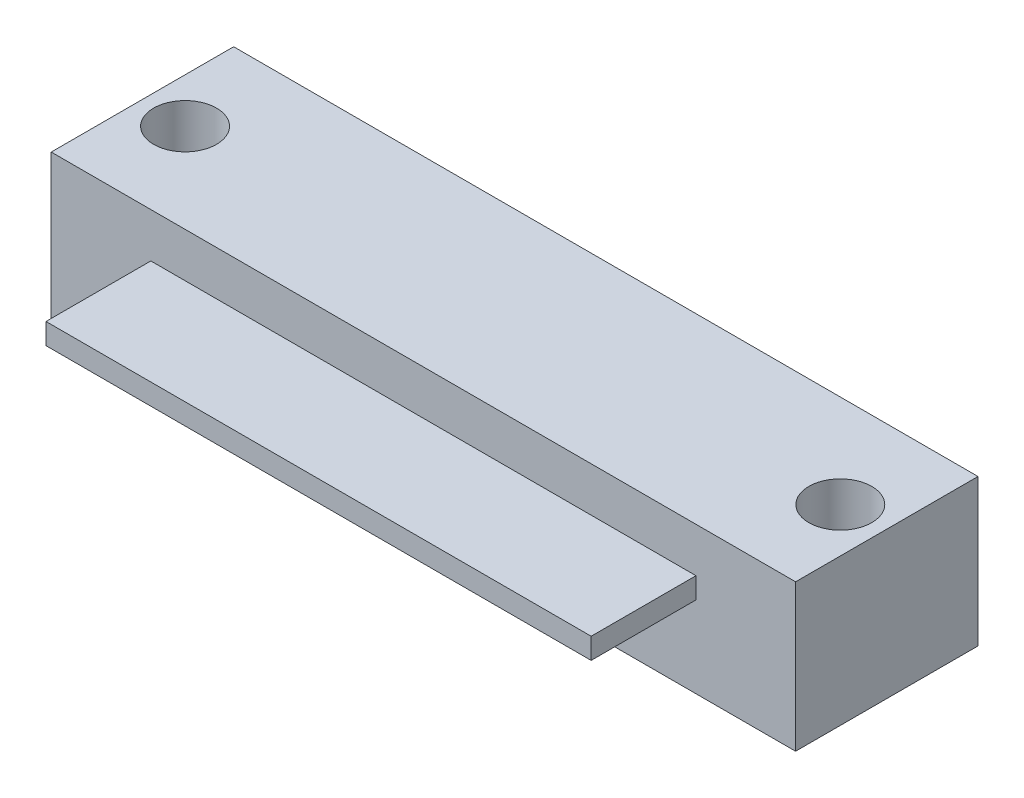
ISO-10303-21;
HEADER;
FILE_DESCRIPTION(('STEP AP214'),'2;1');
FILE_NAME('part.step','',(''),(''),'','','');
FILE_SCHEMA(('AUTOMOTIVE_DESIGN { 1 0 10303 214 1 1 1 1 }'));
ENDSEC;
DATA;
#1=APPLICATION_CONTEXT('core data for automotive mechanical design processes');
#2=APPLICATION_PROTOCOL_DEFINITION('international standard','automotive_design',2000,#1);
#3=PRODUCT_CONTEXT('',#1,'mechanical');
#4=PRODUCT('Part','Part','',(#3));
#5=PRODUCT_RELATED_PRODUCT_CATEGORY('part','',(#4));
#6=PRODUCT_DEFINITION_FORMATION('','',#4);
#7=PRODUCT_DEFINITION_CONTEXT('part definition',#1,'design');
#8=PRODUCT_DEFINITION('design','',#6,#7);
#9=PRODUCT_DEFINITION_SHAPE('','',#8);
#10=(LENGTH_UNIT() NAMED_UNIT(*) SI_UNIT(.MILLI.,.METRE.));
#11=(NAMED_UNIT(*) PLANE_ANGLE_UNIT() SI_UNIT($,.RADIAN.));
#12=(NAMED_UNIT(*) SI_UNIT($,.STERADIAN.) SOLID_ANGLE_UNIT());
#13=UNCERTAINTY_MEASURE_WITH_UNIT(LENGTH_MEASURE(1.E-05),#10,'distance_accuracy_value','');
#14=(GEOMETRIC_REPRESENTATION_CONTEXT(3) GLOBAL_UNCERTAINTY_ASSIGNED_CONTEXT((#13)) GLOBAL_UNIT_ASSIGNED_CONTEXT((#10,
#11,#12)) REPRESENTATION_CONTEXT('',''));
#15=CARTESIAN_POINT('',(0.,0.,0.));
#16=DIRECTION('',(0.,0.,1.));
#17=DIRECTION('',(1.,0.,0.));
#18=AXIS2_PLACEMENT_3D('',#15,#16,#17);
#19=CARTESIAN_POINT('',(0.,17.78,0.));
#20=DIRECTION('',(0.,0.,-1.));
#21=DIRECTION('',(-1.,0.,0.));
#22=AXIS2_PLACEMENT_3D('',#19,#20,#21);
#23=PLANE('',#22);
#24=DIRECTION('',(1.,0.,0.));
#25=VECTOR('',#24,1.);
#26=CARTESIAN_POINT('',(0.,0.,0.));
#27=LINE('',#26,#25);
#28=CARTESIAN_POINT('',(0.,0.,0.));
#29=VERTEX_POINT('',#28);
#30=CARTESIAN_POINT('',(90.17,0.,0.));
#31=VERTEX_POINT('',#30);
#32=EDGE_CURVE('E133',#29,#31,#27,.T.);
#33=ORIENTED_EDGE('',*,*,#32,.T.);
#34=DIRECTION('',(0.,-1.,0.));
#35=VECTOR('',#34,1.);
#36=CARTESIAN_POINT('',(90.17,17.78,0.));
#37=LINE('',#36,#35);
#38=CARTESIAN_POINT('',(90.17,17.78,0.));
#39=VERTEX_POINT('',#38);
#40=EDGE_CURVE('E53',#39,#31,#37,.T.);
#41=ORIENTED_EDGE('',*,*,#40,.F.);
#42=DIRECTION('',(1.,0.,0.));
#43=VECTOR('',#42,1.);
#44=CARTESIAN_POINT('',(0.,17.78,0.));
#45=LINE('',#44,#43);
#46=CARTESIAN_POINT('',(0.,17.78,0.));
#47=VERTEX_POINT('',#46);
#48=EDGE_CURVE('E142',#47,#39,#45,.T.);
#49=ORIENTED_EDGE('',*,*,#48,.F.);
#50=DIRECTION('',(0.,-1.,0.));
#51=VECTOR('',#50,1.);
#52=CARTESIAN_POINT('',(0.,17.78,0.));
#53=LINE('',#52,#51);
#54=EDGE_CURVE('E13',#47,#29,#53,.T.);
#55=ORIENTED_EDGE('',*,*,#54,.T.);
#56=EDGE_LOOP('',(#33,#41,#49,#55));
#57=FACE_BOUND('',#56,.T.);
#58=DIRECTION('',(0.,1.,0.));
#59=VECTOR('',#58,1.);
#60=CARTESIAN_POINT('',(78.105,9.84763129507548,0.));
#61=LINE('',#60,#59);
#62=CARTESIAN_POINT('',(78.105,9.84763129507548,0.));
#63=VERTEX_POINT('',#62);
#64=CARTESIAN_POINT('',(78.105,12.3876312950755,0.));
#65=VERTEX_POINT('',#64);
#66=EDGE_CURVE('E60',#63,#65,#61,.T.);
#67=ORIENTED_EDGE('',*,*,#66,.F.);
#68=DIRECTION('',(1.,0.,0.));
#69=VECTOR('',#68,1.);
#70=CARTESIAN_POINT('',(12.065,9.84763129507548,0.));
#71=LINE('',#70,#69);
#72=CARTESIAN_POINT('',(12.065,9.84763129507548,0.));
#73=VERTEX_POINT('',#72);
#74=EDGE_CURVE('E64',#73,#63,#71,.T.);
#75=ORIENTED_EDGE('',*,*,#74,.F.);
#76=DIRECTION('',(0.,-1.,0.));
#77=VECTOR('',#76,1.);
#78=CARTESIAN_POINT('',(12.065,9.84763129507548,0.));
#79=LINE('',#78,#77);
#80=CARTESIAN_POINT('',(12.065,12.3876312950755,0.));
#81=VERTEX_POINT('',#80);
#82=EDGE_CURVE('E267',#81,#73,#79,.T.);
#83=ORIENTED_EDGE('',*,*,#82,.F.);
#84=DIRECTION('',(-1.,0.,0.));
#85=VECTOR('',#84,1.);
#86=CARTESIAN_POINT('',(12.065,12.3876312950755,0.));
#87=LINE('',#86,#85);
#88=EDGE_CURVE('E265',#65,#81,#87,.T.);
#89=ORIENTED_EDGE('',*,*,#88,.F.);
#90=EDGE_LOOP('',(#67,#75,#83,#89));
#91=FACE_BOUND('',#90,.T.);
#92=ADVANCED_FACE('F45',(#57,#91),#23,.F.);
#93=CARTESIAN_POINT('',(0.,17.78,0.));
#94=DIRECTION('',(1.,0.,0.));
#95=DIRECTION('',(0.,0.,-1.));
#96=AXIS2_PLACEMENT_3D('',#93,#94,#95);
#97=PLANE('',#96);
#98=DIRECTION('',(0.,0.,1.));
#99=VECTOR('',#98,1.);
#100=CARTESIAN_POINT('',(0.,0.,0.));
#101=LINE('',#100,#99);
#102=CARTESIAN_POINT('',(0.,0.,-22.098));
#103=VERTEX_POINT('',#102);
#104=EDGE_CURVE('E130',#103,#29,#101,.T.);
#105=ORIENTED_EDGE('',*,*,#104,.T.);
#106=ORIENTED_EDGE('',*,*,#54,.F.);
#107=DIRECTION('',(0.,0.,1.));
#108=VECTOR('',#107,1.);
#109=CARTESIAN_POINT('',(0.,17.78,0.));
#110=LINE('',#109,#108);
#111=CARTESIAN_POINT('',(0.,17.78,-22.098));
#112=VERTEX_POINT('',#111);
#113=EDGE_CURVE('E139',#112,#47,#110,.T.);
#114=ORIENTED_EDGE('',*,*,#113,.F.);
#115=DIRECTION('',(0.,-1.,0.));
#116=VECTOR('',#115,1.);
#117=CARTESIAN_POINT('',(0.,17.78,-22.098));
#118=LINE('',#117,#116);
#119=EDGE_CURVE('E148',#112,#103,#118,.T.);
#120=ORIENTED_EDGE('',*,*,#119,.T.);
#121=EDGE_LOOP('',(#105,#106,#114,#120));
#122=FACE_BOUND('',#121,.T.);
#123=ADVANCED_FACE('F47',(#122),#97,.F.);
#124=CARTESIAN_POINT('',(90.17,17.78,0.));
#125=DIRECTION('',(-1.,0.,0.));
#126=DIRECTION('',(0.,0.,1.));
#127=AXIS2_PLACEMENT_3D('',#124,#125,#126);
#128=PLANE('',#127);
#129=DIRECTION('',(0.,0.,-1.));
#130=VECTOR('',#129,1.);
#131=CARTESIAN_POINT('',(90.17,0.,0.));
#132=LINE('',#131,#130);
#133=CARTESIAN_POINT('',(90.17,0.,-22.098));
#134=VERTEX_POINT('',#133);
#135=EDGE_CURVE('E151',#31,#134,#132,.T.);
#136=ORIENTED_EDGE('',*,*,#135,.T.);
#137=DIRECTION('',(0.,-1.,0.));
#138=VECTOR('',#137,1.);
#139=CARTESIAN_POINT('',(90.17,17.78,-22.098));
#140=LINE('',#139,#138);
#141=CARTESIAN_POINT('',(90.17,17.78,-22.098));
#142=VERTEX_POINT('',#141);
#143=EDGE_CURVE('E156',#142,#134,#140,.T.);
#144=ORIENTED_EDGE('',*,*,#143,.F.);
#145=DIRECTION('',(0.,0.,-1.));
#146=VECTOR('',#145,1.);
#147=CARTESIAN_POINT('',(90.17,17.78,0.));
#148=LINE('',#147,#146);
#149=EDGE_CURVE('E145',#39,#142,#148,.T.);
#150=ORIENTED_EDGE('',*,*,#149,.F.);
#151=ORIENTED_EDGE('',*,*,#40,.T.);
#152=EDGE_LOOP('',(#136,#144,#150,#151));
#153=FACE_BOUND('',#152,.T.);
#154=ADVANCED_FACE('F163',(#153),#128,.F.);
#155=CARTESIAN_POINT('',(0.,17.78,-22.098));
#156=DIRECTION('',(0.,0.,1.));
#157=DIRECTION('',(1.,0.,0.));
#158=AXIS2_PLACEMENT_3D('',#155,#156,#157);
#159=PLANE('',#158);
#160=DIRECTION('',(-1.,0.,0.));
#161=VECTOR('',#160,1.);
#162=CARTESIAN_POINT('',(0.,0.,-22.098));
#163=LINE('',#162,#161);
#164=EDGE_CURVE('E143',#134,#103,#163,.T.);
#165=ORIENTED_EDGE('',*,*,#164,.T.);
#166=ORIENTED_EDGE('',*,*,#119,.F.);
#167=DIRECTION('',(-1.,0.,0.));
#168=VECTOR('',#167,1.);
#169=CARTESIAN_POINT('',(0.,17.78,-22.098));
#170=LINE('',#169,#168);
#171=EDGE_CURVE('E147',#142,#112,#170,.T.);
#172=ORIENTED_EDGE('',*,*,#171,.F.);
#173=ORIENTED_EDGE('',*,*,#143,.T.);
#174=EDGE_LOOP('',(#165,#166,#172,#173));
#175=FACE_BOUND('',#174,.T.);
#176=ADVANCED_FACE('F172',(#175),#159,.F.);
#177=CARTESIAN_POINT('',(0.,17.78,0.));
#178=DIRECTION('',(0.,-1.,0.));
#179=DIRECTION('',(0.,0.,-1.));
#180=AXIS2_PLACEMENT_3D('',#177,#178,#179);
#181=PLANE('',#180);
#182=CARTESIAN_POINT('',(5.3975,17.78,-10.8148528790261));
#183=DIRECTION('',(0.,1.,0.));
#184=DIRECTION('',(0.,0.,1.));
#185=AXIS2_PLACEMENT_3D('',#182,#183,#184);
#186=CIRCLE('',#185,3.81);
#187=CARTESIAN_POINT('',(5.3975,17.78,-7.00485287902607));
#188=VERTEX_POINT('',#187);
#189=EDGE_CURVE('E239',#188,#188,#186,.T.);
#190=ORIENTED_EDGE('',*,*,#189,.F.);
#191=EDGE_LOOP('',(#190));
#192=FACE_BOUND('',#191,.T.);
#193=CARTESIAN_POINT('',(84.7725,17.78,-10.8148528790261));
#194=DIRECTION('',(0.,1.,0.));
#195=DIRECTION('',(0.,0.,1.));
#196=AXIS2_PLACEMENT_3D('',#193,#194,#195);
#197=CIRCLE('',#196,3.80999999999999);
#198=CARTESIAN_POINT('',(84.7725,17.78,-7.00485287902608));
#199=VERTEX_POINT('',#198);
#200=EDGE_CURVE('E249',#199,#199,#197,.T.);
#201=ORIENTED_EDGE('',*,*,#200,.F.);
#202=EDGE_LOOP('',(#201));
#203=FACE_BOUND('',#202,.T.);
#204=ORIENTED_EDGE('',*,*,#113,.T.);
#205=ORIENTED_EDGE('',*,*,#48,.T.);
#206=ORIENTED_EDGE('',*,*,#149,.T.);
#207=ORIENTED_EDGE('',*,*,#171,.T.);
#208=EDGE_LOOP('',(#204,#205,#206,#207));
#209=FACE_BOUND('',#208,.T.);
#210=ADVANCED_FACE('F178',(#192,#203,#209),#181,.F.);
#211=CARTESIAN_POINT('',(0.,0.,0.));
#212=DIRECTION('',(0.,-1.,0.));
#213=DIRECTION('',(0.,0.,-1.));
#214=AXIS2_PLACEMENT_3D('',#211,#212,#213);
#215=PLANE('',#214);
#216=CARTESIAN_POINT('',(5.3975,0.,-10.8148528790261));
#217=DIRECTION('',(0.,1.,0.));
#218=DIRECTION('',(0.,0.,1.));
#219=AXIS2_PLACEMENT_3D('',#216,#217,#218);
#220=CIRCLE('',#219,1.905);
#221=CARTESIAN_POINT('',(5.3975,0.,-8.90985287902608));
#222=VERTEX_POINT('',#221);
#223=EDGE_CURVE('E246',#222,#222,#220,.T.);
#224=ORIENTED_EDGE('',*,*,#223,.T.);
#225=EDGE_LOOP('',(#224));
#226=FACE_BOUND('',#225,.T.);
#227=CARTESIAN_POINT('',(84.7725,0.,-10.8148528790261));
#228=DIRECTION('',(0.,1.,0.));
#229=DIRECTION('',(0.,0.,1.));
#230=AXIS2_PLACEMENT_3D('',#227,#228,#229);
#231=CIRCLE('',#230,1.90499999999999);
#232=CARTESIAN_POINT('',(84.7725,0.,-8.90985287902608));
#233=VERTEX_POINT('',#232);
#234=EDGE_CURVE('E258',#233,#233,#231,.T.);
#235=ORIENTED_EDGE('',*,*,#234,.T.);
#236=EDGE_LOOP('',(#235));
#237=FACE_BOUND('',#236,.T.);
#238=ORIENTED_EDGE('',*,*,#104,.F.);
#239=ORIENTED_EDGE('',*,*,#164,.F.);
#240=ORIENTED_EDGE('',*,*,#135,.F.);
#241=ORIENTED_EDGE('',*,*,#32,.F.);
#242=EDGE_LOOP('',(#238,#239,#240,#241));
#243=FACE_BOUND('',#242,.T.);
#244=ADVANCED_FACE('F169',(#226,#237,#243),#215,.T.);
#245=CARTESIAN_POINT('',(78.105,9.84763129507548,12.7));
#246=DIRECTION('',(-1.,0.,0.));
#247=DIRECTION('',(0.,0.,1.));
#248=AXIS2_PLACEMENT_3D('',#245,#246,#247);
#249=PLANE('',#248);
#250=ORIENTED_EDGE('',*,*,#66,.T.);
#251=DIRECTION('',(0.,0.,-1.));
#252=VECTOR('',#251,1.);
#253=CARTESIAN_POINT('',(78.105,12.3876312950755,12.7));
#254=LINE('',#253,#252);
#255=CARTESIAN_POINT('',(78.105,12.3876312950755,12.7));
#256=VERTEX_POINT('',#255);
#257=EDGE_CURVE('E113',#256,#65,#254,.T.);
#258=ORIENTED_EDGE('',*,*,#257,.F.);
#259=DIRECTION('',(0.,1.,0.));
#260=VECTOR('',#259,1.);
#261=CARTESIAN_POINT('',(78.105,9.84763129507548,12.7));
#262=LINE('',#261,#260);
#263=CARTESIAN_POINT('',(78.105,9.84763129507548,12.7));
#264=VERTEX_POINT('',#263);
#265=EDGE_CURVE('E119',#264,#256,#262,.T.);
#266=ORIENTED_EDGE('',*,*,#265,.F.);
#267=DIRECTION('',(0.,0.,-1.));
#268=VECTOR('',#267,1.);
#269=CARTESIAN_POINT('',(78.105,9.84763129507548,12.7));
#270=LINE('',#269,#268);
#271=EDGE_CURVE('E263',#264,#63,#270,.T.);
#272=ORIENTED_EDGE('',*,*,#271,.T.);
#273=EDGE_LOOP('',(#250,#258,#266,#272));
#274=FACE_BOUND('',#273,.T.);
#275=ADVANCED_FACE('F129',(#274),#249,.F.);
#276=CARTESIAN_POINT('',(12.065,12.3876312950755,12.7));
#277=DIRECTION('',(0.,-1.,0.));
#278=DIRECTION('',(0.,0.,-1.));
#279=AXIS2_PLACEMENT_3D('',#276,#277,#278);
#280=PLANE('',#279);
#281=ORIENTED_EDGE('',*,*,#88,.T.);
#282=DIRECTION('',(0.,0.,-1.));
#283=VECTOR('',#282,1.);
#284=CARTESIAN_POINT('',(12.065,12.3876312950755,12.7));
#285=LINE('',#284,#283);
#286=CARTESIAN_POINT('',(12.065,12.3876312950755,12.7));
#287=VERTEX_POINT('',#286);
#288=EDGE_CURVE('E115',#287,#81,#285,.T.);
#289=ORIENTED_EDGE('',*,*,#288,.F.);
#290=DIRECTION('',(-1.,0.,0.));
#291=VECTOR('',#290,1.);
#292=CARTESIAN_POINT('',(12.065,12.3876312950755,12.7));
#293=LINE('',#292,#291);
#294=EDGE_CURVE('E108',#256,#287,#293,.T.);
#295=ORIENTED_EDGE('',*,*,#294,.F.);
#296=ORIENTED_EDGE('',*,*,#257,.T.);
#297=EDGE_LOOP('',(#281,#289,#295,#296));
#298=FACE_BOUND('',#297,.T.);
#299=ADVANCED_FACE('F111',(#298),#280,.F.);
#300=CARTESIAN_POINT('',(12.065,9.84763129507548,12.7));
#301=DIRECTION('',(1.,0.,0.));
#302=DIRECTION('',(0.,0.,-1.));
#303=AXIS2_PLACEMENT_3D('',#300,#301,#302);
#304=PLANE('',#303);
#305=ORIENTED_EDGE('',*,*,#82,.T.);
#306=DIRECTION('',(0.,0.,-1.));
#307=VECTOR('',#306,1.);
#308=CARTESIAN_POINT('',(12.065,9.84763129507548,12.7));
#309=LINE('',#308,#307);
#310=CARTESIAN_POINT('',(12.065,9.84763129507548,12.7));
#311=VERTEX_POINT('',#310);
#312=EDGE_CURVE('E135',#311,#73,#309,.T.);
#313=ORIENTED_EDGE('',*,*,#312,.F.);
#314=DIRECTION('',(0.,-1.,0.));
#315=VECTOR('',#314,1.);
#316=CARTESIAN_POINT('',(12.065,9.84763129507548,12.7));
#317=LINE('',#316,#315);
#318=EDGE_CURVE('E118',#287,#311,#317,.T.);
#319=ORIENTED_EDGE('',*,*,#318,.F.);
#320=ORIENTED_EDGE('',*,*,#288,.T.);
#321=EDGE_LOOP('',(#305,#313,#319,#320));
#322=FACE_BOUND('',#321,.T.);
#323=ADVANCED_FACE('F198',(#322),#304,.F.);
#324=CARTESIAN_POINT('',(12.065,9.84763129507548,12.7));
#325=DIRECTION('',(0.,1.,0.));
#326=DIRECTION('',(0.,0.,1.));
#327=AXIS2_PLACEMENT_3D('',#324,#325,#326);
#328=PLANE('',#327);
#329=ORIENTED_EDGE('',*,*,#74,.T.);
#330=ORIENTED_EDGE('',*,*,#271,.F.);
#331=DIRECTION('',(1.,0.,0.));
#332=VECTOR('',#331,1.);
#333=CARTESIAN_POINT('',(12.065,9.84763129507548,12.7));
#334=LINE('',#333,#332);
#335=EDGE_CURVE('E124',#311,#264,#334,.T.);
#336=ORIENTED_EDGE('',*,*,#335,.F.);
#337=ORIENTED_EDGE('',*,*,#312,.T.);
#338=EDGE_LOOP('',(#329,#330,#336,#337));
#339=FACE_BOUND('',#338,.T.);
#340=ADVANCED_FACE('F201',(#339),#328,.F.);
#341=CARTESIAN_POINT('',(0.,0.,12.7));
#342=DIRECTION('',(0.,0.,-1.));
#343=DIRECTION('',(-1.,0.,0.));
#344=AXIS2_PLACEMENT_3D('',#341,#342,#343);
#345=PLANE('',#344);
#346=ORIENTED_EDGE('',*,*,#265,.T.);
#347=ORIENTED_EDGE('',*,*,#294,.T.);
#348=ORIENTED_EDGE('',*,*,#318,.T.);
#349=ORIENTED_EDGE('',*,*,#335,.T.);
#350=EDGE_LOOP('',(#346,#347,#348,#349));
#351=FACE_BOUND('',#350,.T.);
#352=ADVANCED_FACE('F122',(#351),#345,.F.);
#353=CARTESIAN_POINT('',(84.7725,17.78,-10.8148528790261));
#354=DIRECTION('',(0.,1.,0.));
#355=DIRECTION('',(0.,0.,1.));
#356=AXIS2_PLACEMENT_3D('',#353,#354,#355);
#357=CYLINDRICAL_SURFACE('',#356,1.905);
#358=ORIENTED_EDGE('',*,*,#234,.F.);
#359=EDGE_LOOP('',(#358));
#360=FACE_BOUND('',#359,.T.);
#361=CARTESIAN_POINT('',(84.7725,6.604,-10.8148528790261));
#362=DIRECTION('',(0.,1.,0.));
#363=DIRECTION('',(0.,0.,1.));
#364=AXIS2_PLACEMENT_3D('',#361,#362,#363);
#365=CIRCLE('',#364,1.905);
#366=CARTESIAN_POINT('',(84.7725,6.604,-8.90985287902607));
#367=VERTEX_POINT('',#366);
#368=EDGE_CURVE('E255',#367,#367,#365,.T.);
#369=ORIENTED_EDGE('',*,*,#368,.T.);
#370=EDGE_LOOP('',(#369));
#371=FACE_BOUND('',#370,.T.);
#372=ADVANCED_FACE('F208',(#360,#371),#357,.F.);
#373=CARTESIAN_POINT('',(86.6775,6.604,-10.8148528790261));
#374=DIRECTION('',(0.,-1.,0.));
#375=DIRECTION('',(0.,0.,-1.));
#376=AXIS2_PLACEMENT_3D('',#373,#374,#375);
#377=PLANE('',#376);
#378=ORIENTED_EDGE('',*,*,#368,.F.);
#379=EDGE_LOOP('',(#378));
#380=FACE_BOUND('',#379,.T.);
#381=CARTESIAN_POINT('',(84.7725,6.604,-10.8148528790261));
#382=DIRECTION('',(0.,1.,0.));
#383=DIRECTION('',(0.,0.,1.));
#384=AXIS2_PLACEMENT_3D('',#381,#382,#383);
#385=CIRCLE('',#384,3.80999999999999);
#386=CARTESIAN_POINT('',(84.7725,6.604,-7.00485287902608));
#387=VERTEX_POINT('',#386);
#388=EDGE_CURVE('E252',#387,#387,#385,.T.);
#389=ORIENTED_EDGE('',*,*,#388,.T.);
#390=EDGE_LOOP('',(#389));
#391=FACE_BOUND('',#390,.T.);
#392=ADVANCED_FACE('F211',(#380,#391),#377,.F.);
#393=CARTESIAN_POINT('',(84.7725,17.78,-10.8148528790261));
#394=DIRECTION('',(0.,1.,0.));
#395=DIRECTION('',(0.,0.,1.));
#396=AXIS2_PLACEMENT_3D('',#393,#394,#395);
#397=CYLINDRICAL_SURFACE('',#396,3.80999999999999);
#398=ORIENTED_EDGE('',*,*,#388,.F.);
#399=EDGE_LOOP('',(#398));
#400=FACE_BOUND('',#399,.T.);
#401=ORIENTED_EDGE('',*,*,#200,.T.);
#402=EDGE_LOOP('',(#401));
#403=FACE_BOUND('',#402,.T.);
#404=ADVANCED_FACE('F215',(#400,#403),#397,.F.);
#405=CARTESIAN_POINT('',(5.3975,17.78,-10.8148528790261));
#406=DIRECTION('',(0.,1.,0.));
#407=DIRECTION('',(0.,0.,1.));
#408=AXIS2_PLACEMENT_3D('',#405,#406,#407);
#409=CYLINDRICAL_SURFACE('',#408,1.905);
#410=ORIENTED_EDGE('',*,*,#223,.F.);
#411=EDGE_LOOP('',(#410));
#412=FACE_BOUND('',#411,.T.);
#413=CARTESIAN_POINT('',(5.3975,6.604,-10.8148528790261));
#414=DIRECTION('',(0.,1.,0.));
#415=DIRECTION('',(0.,0.,1.));
#416=AXIS2_PLACEMENT_3D('',#413,#414,#415);
#417=CIRCLE('',#416,1.905);
#418=CARTESIAN_POINT('',(5.3975,6.604,-8.90985287902608));
#419=VERTEX_POINT('',#418);
#420=EDGE_CURVE('E241',#419,#419,#417,.T.);
#421=ORIENTED_EDGE('',*,*,#420,.T.);
#422=EDGE_LOOP('',(#421));
#423=FACE_BOUND('',#422,.T.);
#424=ADVANCED_FACE('F219',(#412,#423),#409,.F.);
#425=CARTESIAN_POINT('',(7.3025,6.604,-10.8148528790261));
#426=DIRECTION('',(0.,-1.,0.));
#427=DIRECTION('',(0.,0.,-1.));
#428=AXIS2_PLACEMENT_3D('',#425,#426,#427);
#429=PLANE('',#428);
#430=ORIENTED_EDGE('',*,*,#420,.F.);
#431=EDGE_LOOP('',(#430));
#432=FACE_BOUND('',#431,.T.);
#433=CARTESIAN_POINT('',(5.3975,6.604,-10.8148528790261));
#434=DIRECTION('',(0.,1.,0.));
#435=DIRECTION('',(0.,0.,1.));
#436=AXIS2_PLACEMENT_3D('',#433,#434,#435);
#437=CIRCLE('',#436,3.81);
#438=CARTESIAN_POINT('',(5.3975,6.604,-7.00485287902608));
#439=VERTEX_POINT('',#438);
#440=EDGE_CURVE('E236',#439,#439,#437,.T.);
#441=ORIENTED_EDGE('',*,*,#440,.T.);
#442=EDGE_LOOP('',(#441));
#443=FACE_BOUND('',#442,.T.);
#444=ADVANCED_FACE('F223',(#432,#443),#429,.F.);
#445=CARTESIAN_POINT('',(5.3975,17.78,-10.8148528790261));
#446=DIRECTION('',(0.,1.,0.));
#447=DIRECTION('',(0.,0.,1.));
#448=AXIS2_PLACEMENT_3D('',#445,#446,#447);
#449=CYLINDRICAL_SURFACE('',#448,3.81);
#450=ORIENTED_EDGE('',*,*,#440,.F.);
#451=EDGE_LOOP('',(#450));
#452=FACE_BOUND('',#451,.T.);
#453=ORIENTED_EDGE('',*,*,#189,.T.);
#454=EDGE_LOOP('',(#453));
#455=FACE_BOUND('',#454,.T.);
#456=ADVANCED_FACE('F227',(#452,#455),#449,.F.);
#457=CLOSED_SHELL('',(#92,#123,#154,#176,#210,#244,#275,#299,#323,#340,#352,#372,#392,#404,#424,
#444,#456));
#458=MANIFOLD_SOLID_BREP('B2',#457);
#459=ADVANCED_BREP_SHAPE_REPRESENTATION('',(#18,#458),#14);
#460=SHAPE_DEFINITION_REPRESENTATION(#9,#459);
ENDSEC;
END-ISO-10303-21;
